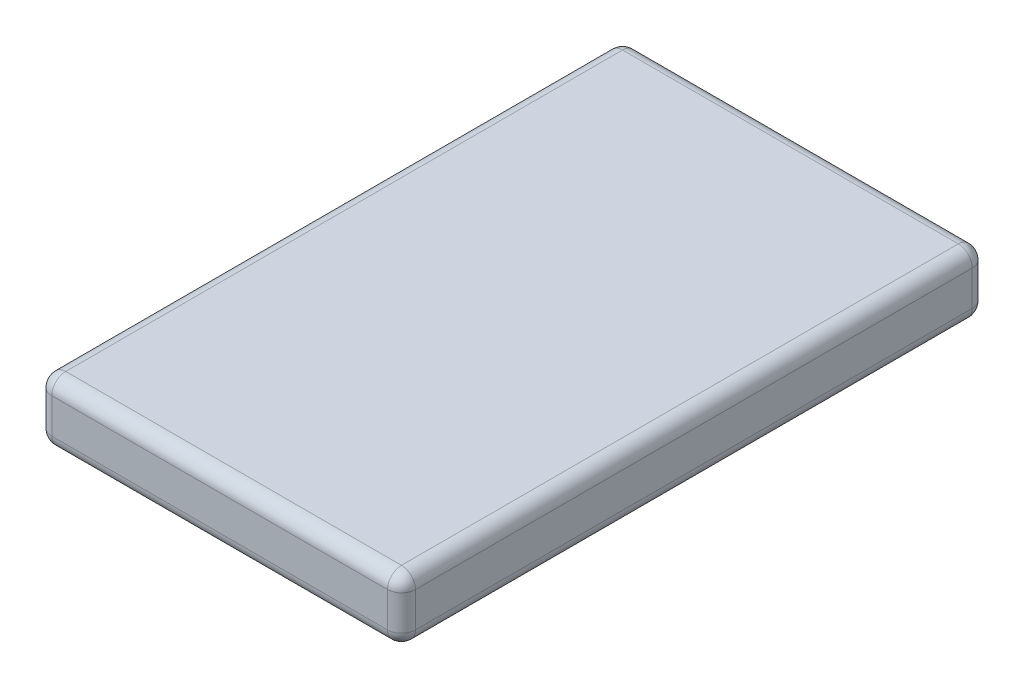
ISO-10303-21;
HEADER;
FILE_DESCRIPTION(('STEP AP214'),'2;1');
FILE_NAME('part.step','',(''),(''),'','','');
FILE_SCHEMA(('AUTOMOTIVE_DESIGN { 1 0 10303 214 1 1 1 1 }'));
ENDSEC;
DATA;
#1=APPLICATION_CONTEXT('core data for automotive mechanical design processes');
#2=APPLICATION_PROTOCOL_DEFINITION('international standard','automotive_design',2000,#1);
#3=PRODUCT_CONTEXT('',#1,'mechanical');
#4=PRODUCT('Part','Part','',(#3));
#5=PRODUCT_RELATED_PRODUCT_CATEGORY('part','',(#4));
#6=PRODUCT_DEFINITION_FORMATION('','',#4);
#7=PRODUCT_DEFINITION_CONTEXT('part definition',#1,'design');
#8=PRODUCT_DEFINITION('design','',#6,#7);
#9=PRODUCT_DEFINITION_SHAPE('','',#8);
#10=(LENGTH_UNIT() NAMED_UNIT(*) SI_UNIT(.MILLI.,.METRE.));
#11=(NAMED_UNIT(*) PLANE_ANGLE_UNIT() SI_UNIT($,.RADIAN.));
#12=(NAMED_UNIT(*) SI_UNIT($,.STERADIAN.) SOLID_ANGLE_UNIT());
#13=UNCERTAINTY_MEASURE_WITH_UNIT(LENGTH_MEASURE(1.E-05),#10,'distance_accuracy_value','');
#14=(GEOMETRIC_REPRESENTATION_CONTEXT(3) GLOBAL_UNCERTAINTY_ASSIGNED_CONTEXT((#13)) GLOBAL_UNIT_ASSIGNED_CONTEXT((#10,
#11,#12)) REPRESENTATION_CONTEXT('',''));
#15=CARTESIAN_POINT('',(0.,0.,0.));
#16=DIRECTION('',(0.,0.,1.));
#17=DIRECTION('',(1.,0.,0.));
#18=AXIS2_PLACEMENT_3D('',#15,#16,#17);
#19=CARTESIAN_POINT('',(16.51,5.715,26.543));
#20=DIRECTION('',(-1.,0.,0.));
#21=DIRECTION('',(0.,0.,1.));
#22=AXIS2_PLACEMENT_3D('',#19,#20,#21);
#23=PLANE('',#22);
#24=DIRECTION('',(0.,-1.,0.));
#25=VECTOR('',#24,1.);
#26=CARTESIAN_POINT('',(16.51,5.715,25.273));
#27=LINE('',#26,#25);
#28=CARTESIAN_POINT('',(16.51,4.445,25.273));
#29=VERTEX_POINT('',#28);
#30=CARTESIAN_POINT('',(16.51,1.27,25.273));
#31=VERTEX_POINT('',#30);
#32=EDGE_CURVE('E175',#29,#31,#27,.T.);
#33=ORIENTED_EDGE('',*,*,#32,.T.);
#34=DIRECTION('',(0.,0.,-1.));
#35=VECTOR('',#34,1.);
#36=CARTESIAN_POINT('',(16.51,1.27,-26.543));
#37=LINE('',#36,#35);
#38=CARTESIAN_POINT('',(16.51,1.27,-25.273));
#39=VERTEX_POINT('',#38);
#40=EDGE_CURVE('E180',#31,#39,#37,.T.);
#41=ORIENTED_EDGE('',*,*,#40,.T.);
#42=DIRECTION('',(0.,-1.,0.));
#43=VECTOR('',#42,1.);
#44=CARTESIAN_POINT('',(16.51,5.715,-25.273));
#45=LINE('',#44,#43);
#46=CARTESIAN_POINT('',(16.51,4.445,-25.273));
#47=VERTEX_POINT('',#46);
#48=EDGE_CURVE('E177',#39,#47,#45,.F.);
#49=ORIENTED_EDGE('',*,*,#48,.T.);
#50=DIRECTION('',(0.,0.,-1.));
#51=VECTOR('',#50,1.);
#52=CARTESIAN_POINT('',(16.51,4.445,26.543));
#53=LINE('',#52,#51);
#54=EDGE_CURVE('E173',#47,#29,#53,.F.);
#55=ORIENTED_EDGE('',*,*,#54,.T.);
#56=EDGE_LOOP('',(#33,#41,#49,#55));
#57=FACE_BOUND('',#56,.T.);
#58=ADVANCED_FACE('F33',(#57),#23,.F.);
#59=CARTESIAN_POINT('',(-16.51,5.715,-26.543));
#60=DIRECTION('',(0.,0.,1.));
#61=DIRECTION('',(1.,0.,0.));
#62=AXIS2_PLACEMENT_3D('',#59,#60,#61);
#63=PLANE('',#62);
#64=DIRECTION('',(0.,-1.,0.));
#65=VECTOR('',#64,1.);
#66=CARTESIAN_POINT('',(15.24,5.715,-26.543));
#67=LINE('',#66,#65);
#68=CARTESIAN_POINT('',(15.24,4.445,-26.543));
#69=VERTEX_POINT('',#68);
#70=CARTESIAN_POINT('',(15.24,1.27,-26.543));
#71=VERTEX_POINT('',#70);
#72=EDGE_CURVE('E166',#69,#71,#67,.T.);
#73=ORIENTED_EDGE('',*,*,#72,.T.);
#74=DIRECTION('',(-1.,0.,0.));
#75=VECTOR('',#74,1.);
#76=CARTESIAN_POINT('',(-16.51,1.27,-26.543));
#77=LINE('',#76,#75);
#78=CARTESIAN_POINT('',(-15.24,1.27,-26.543));
#79=VERTEX_POINT('',#78);
#80=EDGE_CURVE('E171',#71,#79,#77,.T.);
#81=ORIENTED_EDGE('',*,*,#80,.T.);
#82=DIRECTION('',(0.,-1.,0.));
#83=VECTOR('',#82,1.);
#84=CARTESIAN_POINT('',(-15.24,5.715,-26.543));
#85=LINE('',#84,#83);
#86=CARTESIAN_POINT('',(-15.24,4.445,-26.543));
#87=VERTEX_POINT('',#86);
#88=EDGE_CURVE('E168',#79,#87,#85,.F.);
#89=ORIENTED_EDGE('',*,*,#88,.T.);
#90=DIRECTION('',(-1.,0.,0.));
#91=VECTOR('',#90,1.);
#92=CARTESIAN_POINT('',(-16.51,4.445,-26.543));
#93=LINE('',#92,#91);
#94=EDGE_CURVE('E164',#87,#69,#93,.F.);
#95=ORIENTED_EDGE('',*,*,#94,.T.);
#96=EDGE_LOOP('',(#73,#81,#89,#95));
#97=FACE_BOUND('',#96,.T.);
#98=ADVANCED_FACE('F304',(#97),#63,.F.);
#99=CARTESIAN_POINT('',(-16.51,5.715,26.543));
#100=DIRECTION('',(1.,0.,0.));
#101=DIRECTION('',(0.,0.,-1.));
#102=AXIS2_PLACEMENT_3D('',#99,#100,#101);
#103=PLANE('',#102);
#104=DIRECTION('',(0.,-1.,0.));
#105=VECTOR('',#104,1.);
#106=CARTESIAN_POINT('',(-16.51,5.715,-25.273));
#107=LINE('',#106,#105);
#108=CARTESIAN_POINT('',(-16.51,4.445,-25.273));
#109=VERTEX_POINT('',#108);
#110=CARTESIAN_POINT('',(-16.51,1.27,-25.273));
#111=VERTEX_POINT('',#110);
#112=EDGE_CURVE('E132',#109,#111,#107,.T.);
#113=ORIENTED_EDGE('',*,*,#112,.T.);
#114=DIRECTION('',(0.,0.,1.));
#115=VECTOR('',#114,1.);
#116=CARTESIAN_POINT('',(-16.51,1.27,26.543));
#117=LINE('',#116,#115);
#118=CARTESIAN_POINT('',(-16.51,1.27,25.273));
#119=VERTEX_POINT('',#118);
#120=EDGE_CURVE('E128',#111,#119,#117,.T.);
#121=ORIENTED_EDGE('',*,*,#120,.T.);
#122=DIRECTION('',(0.,-1.,0.));
#123=VECTOR('',#122,1.);
#124=CARTESIAN_POINT('',(-16.51,5.715,25.273));
#125=LINE('',#124,#123);
#126=CARTESIAN_POINT('',(-16.51,4.445,25.273));
#127=VERTEX_POINT('',#126);
#128=EDGE_CURVE('E120',#119,#127,#125,.F.);
#129=ORIENTED_EDGE('',*,*,#128,.T.);
#130=DIRECTION('',(0.,0.,1.));
#131=VECTOR('',#130,1.);
#132=CARTESIAN_POINT('',(-16.51,4.445,26.543));
#133=LINE('',#132,#131);
#134=EDGE_CURVE('E125',#127,#109,#133,.F.);
#135=ORIENTED_EDGE('',*,*,#134,.T.);
#136=EDGE_LOOP('',(#113,#121,#129,#135));
#137=FACE_BOUND('',#136,.T.);
#138=ADVANCED_FACE('F123',(#137),#103,.F.);
#139=CARTESIAN_POINT('',(-16.51,5.715,26.543));
#140=DIRECTION('',(0.,0.,-1.));
#141=DIRECTION('',(-1.,0.,0.));
#142=AXIS2_PLACEMENT_3D('',#139,#140,#141);
#143=PLANE('',#142);
#144=DIRECTION('',(0.,-1.,0.));
#145=VECTOR('',#144,1.);
#146=CARTESIAN_POINT('',(-15.24,5.715,26.543));
#147=LINE('',#146,#145);
#148=CARTESIAN_POINT('',(-15.24,4.445,26.543));
#149=VERTEX_POINT('',#148);
#150=CARTESIAN_POINT('',(-15.24,1.27,26.543));
#151=VERTEX_POINT('',#150);
#152=EDGE_CURVE('E140',#149,#151,#147,.T.);
#153=ORIENTED_EDGE('',*,*,#152,.T.);
#154=DIRECTION('',(1.,0.,0.));
#155=VECTOR('',#154,1.);
#156=CARTESIAN_POINT('',(16.51,1.27,26.543));
#157=LINE('',#156,#155);
#158=CARTESIAN_POINT('',(15.24,1.27,26.543));
#159=VERTEX_POINT('',#158);
#160=EDGE_CURVE('E187',#151,#159,#157,.T.);
#161=ORIENTED_EDGE('',*,*,#160,.T.);
#162=DIRECTION('',(0.,-1.,0.));
#163=VECTOR('',#162,1.);
#164=CARTESIAN_POINT('',(15.24,5.715,26.543));
#165=LINE('',#164,#163);
#166=CARTESIAN_POINT('',(15.24,4.445,26.543));
#167=VERTEX_POINT('',#166);
#168=EDGE_CURVE('E184',#159,#167,#165,.F.);
#169=ORIENTED_EDGE('',*,*,#168,.T.);
#170=DIRECTION('',(1.,0.,0.));
#171=VECTOR('',#170,1.);
#172=CARTESIAN_POINT('',(-16.51,4.445,26.543));
#173=LINE('',#172,#171);
#174=EDGE_CURVE('E182',#167,#149,#173,.F.);
#175=ORIENTED_EDGE('',*,*,#174,.T.);
#176=EDGE_LOOP('',(#153,#161,#169,#175));
#177=FACE_BOUND('',#176,.T.);
#178=ADVANCED_FACE('F295',(#177),#143,.F.);
#179=CARTESIAN_POINT('',(16.51,5.715,-26.543));
#180=DIRECTION('',(0.,-1.,0.));
#181=DIRECTION('',(0.,0.,-1.));
#182=AXIS2_PLACEMENT_3D('',#179,#180,#181);
#183=PLANE('',#182);
#184=DIRECTION('',(0.,0.,1.));
#185=VECTOR('',#184,1.);
#186=CARTESIAN_POINT('',(-15.24,5.715,-26.543));
#187=LINE('',#186,#185);
#188=CARTESIAN_POINT('',(-15.24,5.715,-25.273));
#189=VERTEX_POINT('',#188);
#190=CARTESIAN_POINT('',(-15.24,5.715,25.273));
#191=VERTEX_POINT('',#190);
#192=EDGE_CURVE('E42',#189,#191,#187,.T.);
#193=ORIENTED_EDGE('',*,*,#192,.T.);
#194=DIRECTION('',(1.,0.,0.));
#195=VECTOR('',#194,1.);
#196=CARTESIAN_POINT('',(16.51,5.715,25.273));
#197=LINE('',#196,#195);
#198=CARTESIAN_POINT('',(15.24,5.715,25.273));
#199=VERTEX_POINT('',#198);
#200=EDGE_CURVE('E11',#191,#199,#197,.T.);
#201=ORIENTED_EDGE('',*,*,#200,.T.);
#202=DIRECTION('',(0.,0.,-1.));
#203=VECTOR('',#202,1.);
#204=CARTESIAN_POINT('',(15.24,5.715,-26.543));
#205=LINE('',#204,#203);
#206=CARTESIAN_POINT('',(15.24,5.715,-25.273));
#207=VERTEX_POINT('',#206);
#208=EDGE_CURVE('E198',#199,#207,#205,.T.);
#209=ORIENTED_EDGE('',*,*,#208,.T.);
#210=DIRECTION('',(-1.,0.,0.));
#211=VECTOR('',#210,1.);
#212=CARTESIAN_POINT('',(16.51,5.715,-25.273));
#213=LINE('',#212,#211);
#214=EDGE_CURVE('E53',#207,#189,#213,.T.);
#215=ORIENTED_EDGE('',*,*,#214,.T.);
#216=EDGE_LOOP('',(#193,#201,#209,#215));
#217=FACE_BOUND('',#216,.T.);
#218=ADVANCED_FACE('F297',(#217),#183,.F.);
#219=CARTESIAN_POINT('',(16.51,0.,-26.543));
#220=DIRECTION('',(0.,-1.,0.));
#221=DIRECTION('',(0.,0.,-1.));
#222=AXIS2_PLACEMENT_3D('',#219,#220,#221);
#223=PLANE('',#222);
#224=DIRECTION('',(0.,0.,1.));
#225=VECTOR('',#224,1.);
#226=CARTESIAN_POINT('',(-15.24,0.,-26.543));
#227=LINE('',#226,#225);
#228=CARTESIAN_POINT('',(-15.24,0.,25.273));
#229=VERTEX_POINT('',#228);
#230=CARTESIAN_POINT('',(-15.24,0.,-25.273));
#231=VERTEX_POINT('',#230);
#232=EDGE_CURVE('E193',#229,#231,#227,.F.);
#233=ORIENTED_EDGE('',*,*,#232,.T.);
#234=DIRECTION('',(-1.,0.,0.));
#235=VECTOR('',#234,1.);
#236=CARTESIAN_POINT('',(16.51,0.,-25.273));
#237=LINE('',#236,#235);
#238=CARTESIAN_POINT('',(15.24,0.,-25.273));
#239=VERTEX_POINT('',#238);
#240=EDGE_CURVE('E195',#231,#239,#237,.F.);
#241=ORIENTED_EDGE('',*,*,#240,.T.);
#242=DIRECTION('',(0.,0.,-1.));
#243=VECTOR('',#242,1.);
#244=CARTESIAN_POINT('',(15.24,0.,26.543));
#245=LINE('',#244,#243);
#246=CARTESIAN_POINT('',(15.24,0.,25.273));
#247=VERTEX_POINT('',#246);
#248=EDGE_CURVE('E189',#239,#247,#245,.F.);
#249=ORIENTED_EDGE('',*,*,#248,.T.);
#250=DIRECTION('',(1.,0.,0.));
#251=VECTOR('',#250,1.);
#252=CARTESIAN_POINT('',(-16.51,0.,25.273));
#253=LINE('',#252,#251);
#254=EDGE_CURVE('E191',#247,#229,#253,.F.);
#255=ORIENTED_EDGE('',*,*,#254,.T.);
#256=EDGE_LOOP('',(#233,#241,#249,#255));
#257=FACE_BOUND('',#256,.T.);
#258=ADVANCED_FACE('F265',(#257),#223,.T.);
#259=CARTESIAN_POINT('',(15.24,5.715,25.273));
#260=DIRECTION('',(0.,-1.,0.));
#261=DIRECTION('',(0.,0.,-1.));
#262=AXIS2_PLACEMENT_3D('',#259,#260,#261);
#263=CYLINDRICAL_SURFACE('',#262,1.27);
#264=CARTESIAN_POINT('',(15.24,4.445,25.273));
#265=DIRECTION('',(0.,1.,0.));
#266=DIRECTION('',(0.,0.,1.));
#267=AXIS2_PLACEMENT_3D('',#264,#265,#266);
#268=CIRCLE('',#267,1.27);
#269=EDGE_CURVE('E37',#167,#29,#268,.T.);
#270=ORIENTED_EDGE('',*,*,#269,.F.);
#271=ORIENTED_EDGE('',*,*,#168,.F.);
#272=CARTESIAN_POINT('',(15.24,1.27,25.273));
#273=DIRECTION('',(0.,-1.,0.));
#274=DIRECTION('',(0.,0.,-1.));
#275=AXIS2_PLACEMENT_3D('',#272,#273,#274);
#276=CIRCLE('',#275,1.27);
#277=EDGE_CURVE('E160',#31,#159,#276,.T.);
#278=ORIENTED_EDGE('',*,*,#277,.F.);
#279=ORIENTED_EDGE('',*,*,#32,.F.);
#280=EDGE_LOOP('',(#270,#271,#278,#279));
#281=FACE_BOUND('',#280,.T.);
#282=ADVANCED_FACE('F35',(#281),#263,.T.);
#283=CARTESIAN_POINT('',(15.24,4.445,25.273));
#284=DIRECTION('',(0.,0.,1.));
#285=DIRECTION('',(1.,0.,0.));
#286=AXIS2_PLACEMENT_3D('',#283,#284,#285);
#287=SPHERICAL_SURFACE('',#286,1.27);
#288=CARTESIAN_POINT('',(15.24,4.445,25.273));
#289=DIRECTION('',(1.,0.,0.));
#290=DIRECTION('',(0.,0.,-1.));
#291=AXIS2_PLACEMENT_3D('',#288,#289,#290);
#292=CIRCLE('',#291,1.27);
#293=EDGE_CURVE('E243',#167,#199,#292,.F.);
#294=ORIENTED_EDGE('',*,*,#293,.F.);
#295=ORIENTED_EDGE('',*,*,#269,.T.);
#296=CARTESIAN_POINT('',(15.24,4.445,25.273));
#297=DIRECTION('',(0.,0.,1.));
#298=DIRECTION('',(1.,0.,0.));
#299=AXIS2_PLACEMENT_3D('',#296,#297,#298);
#300=CIRCLE('',#299,1.27);
#301=EDGE_CURVE('E246',#199,#29,#300,.F.);
#302=ORIENTED_EDGE('',*,*,#301,.F.);
#303=EDGE_LOOP('',(#294,#295,#302));
#304=FACE_BOUND('',#303,.T.);
#305=ADVANCED_FACE('F290',(#304),#287,.T.);
#306=CARTESIAN_POINT('',(15.24,1.27,25.273));
#307=DIRECTION('',(0.,0.,1.));
#308=DIRECTION('',(1.,0.,0.));
#309=AXIS2_PLACEMENT_3D('',#306,#307,#308);
#310=SPHERICAL_SURFACE('',#309,1.27);
#311=CARTESIAN_POINT('',(15.24,1.27,25.273));
#312=DIRECTION('',(0.,0.,1.));
#313=DIRECTION('',(1.,0.,0.));
#314=AXIS2_PLACEMENT_3D('',#311,#312,#313);
#315=CIRCLE('',#314,1.27);
#316=EDGE_CURVE('E237',#31,#247,#315,.F.);
#317=ORIENTED_EDGE('',*,*,#316,.F.);
#318=ORIENTED_EDGE('',*,*,#277,.T.);
#319=CARTESIAN_POINT('',(15.24,1.27,25.273));
#320=DIRECTION('',(1.,0.,0.));
#321=DIRECTION('',(0.,0.,-1.));
#322=AXIS2_PLACEMENT_3D('',#319,#320,#321);
#323=CIRCLE('',#322,1.27);
#324=EDGE_CURVE('E240',#247,#159,#323,.F.);
#325=ORIENTED_EDGE('',*,*,#324,.F.);
#326=EDGE_LOOP('',(#317,#318,#325));
#327=FACE_BOUND('',#326,.T.);
#328=ADVANCED_FACE('F253',(#327),#310,.T.);
#329=CARTESIAN_POINT('',(15.24,4.445,-26.543));
#330=DIRECTION('',(0.,0.,-1.));
#331=DIRECTION('',(-1.,0.,0.));
#332=AXIS2_PLACEMENT_3D('',#329,#330,#331);
#333=CYLINDRICAL_SURFACE('',#332,1.27);
#334=ORIENTED_EDGE('',*,*,#301,.T.);
#335=ORIENTED_EDGE('',*,*,#54,.F.);
#336=CARTESIAN_POINT('',(15.24,4.445,-25.273));
#337=DIRECTION('',(0.,0.,-1.));
#338=DIRECTION('',(-1.,0.,0.));
#339=AXIS2_PLACEMENT_3D('',#336,#337,#338);
#340=CIRCLE('',#339,1.27);
#341=EDGE_CURVE('E232',#207,#47,#340,.T.);
#342=ORIENTED_EDGE('',*,*,#341,.F.);
#343=ORIENTED_EDGE('',*,*,#208,.F.);
#344=EDGE_LOOP('',(#334,#335,#342,#343));
#345=FACE_BOUND('',#344,.T.);
#346=ADVANCED_FACE('F285',(#345),#333,.T.);
#347=CARTESIAN_POINT('',(16.51,4.445,25.273));
#348=DIRECTION('',(1.,0.,0.));
#349=DIRECTION('',(0.,0.,-1.));
#350=AXIS2_PLACEMENT_3D('',#347,#348,#349);
#351=CYLINDRICAL_SURFACE('',#350,1.27);
#352=ORIENTED_EDGE('',*,*,#293,.T.);
#353=ORIENTED_EDGE('',*,*,#200,.F.);
#354=CARTESIAN_POINT('',(-15.24,4.445,25.273));
#355=DIRECTION('',(-1.,0.,0.));
#356=DIRECTION('',(0.,0.,1.));
#357=AXIS2_PLACEMENT_3D('',#354,#355,#356);
#358=CIRCLE('',#357,1.27);
#359=EDGE_CURVE('E144',#149,#191,#358,.T.);
#360=ORIENTED_EDGE('',*,*,#359,.F.);
#361=ORIENTED_EDGE('',*,*,#174,.F.);
#362=EDGE_LOOP('',(#352,#353,#360,#361));
#363=FACE_BOUND('',#362,.T.);
#364=ADVANCED_FACE('F293',(#363),#351,.T.);
#365=CARTESIAN_POINT('',(-15.24,5.715,25.273));
#366=DIRECTION('',(0.,-1.,0.));
#367=DIRECTION('',(0.,0.,-1.));
#368=AXIS2_PLACEMENT_3D('',#365,#366,#367);
#369=CYLINDRICAL_SURFACE('',#368,1.27);
#370=CARTESIAN_POINT('',(-15.24,1.27,25.273));
#371=DIRECTION('',(0.,-1.,0.));
#372=DIRECTION('',(0.,0.,-1.));
#373=AXIS2_PLACEMENT_3D('',#370,#371,#372);
#374=CIRCLE('',#373,1.27);
#375=EDGE_CURVE('E145',#151,#119,#374,.T.);
#376=ORIENTED_EDGE('',*,*,#375,.F.);
#377=ORIENTED_EDGE('',*,*,#152,.F.);
#378=CARTESIAN_POINT('',(-15.24,4.445,25.273));
#379=DIRECTION('',(0.,1.,0.));
#380=DIRECTION('',(0.,0.,1.));
#381=AXIS2_PLACEMENT_3D('',#378,#379,#380);
#382=CIRCLE('',#381,1.27);
#383=EDGE_CURVE('E136',#127,#149,#382,.T.);
#384=ORIENTED_EDGE('',*,*,#383,.F.);
#385=ORIENTED_EDGE('',*,*,#128,.F.);
#386=EDGE_LOOP('',(#376,#377,#384,#385));
#387=FACE_BOUND('',#386,.T.);
#388=ADVANCED_FACE('F138',(#387),#369,.T.);
#389=CARTESIAN_POINT('',(-16.51,1.27,25.273));
#390=DIRECTION('',(-1.,0.,0.));
#391=DIRECTION('',(0.,0.,1.));
#392=AXIS2_PLACEMENT_3D('',#389,#390,#391);
#393=CYLINDRICAL_SURFACE('',#392,1.27);
#394=ORIENTED_EDGE('',*,*,#324,.T.);
#395=ORIENTED_EDGE('',*,*,#160,.F.);
#396=CARTESIAN_POINT('',(-15.24,1.27,25.273));
#397=DIRECTION('',(-1.,0.,0.));
#398=DIRECTION('',(0.,0.,1.));
#399=AXIS2_PLACEMENT_3D('',#396,#397,#398);
#400=CIRCLE('',#399,1.27);
#401=EDGE_CURVE('E228',#229,#151,#400,.T.);
#402=ORIENTED_EDGE('',*,*,#401,.F.);
#403=ORIENTED_EDGE('',*,*,#254,.F.);
#404=EDGE_LOOP('',(#394,#395,#402,#403));
#405=FACE_BOUND('',#404,.T.);
#406=ADVANCED_FACE('F261',(#405),#393,.T.);
#407=CARTESIAN_POINT('',(15.24,1.27,26.543));
#408=DIRECTION('',(0.,0.,1.));
#409=DIRECTION('',(1.,0.,0.));
#410=AXIS2_PLACEMENT_3D('',#407,#408,#409);
#411=CYLINDRICAL_SURFACE('',#410,1.27);
#412=ORIENTED_EDGE('',*,*,#316,.T.);
#413=ORIENTED_EDGE('',*,*,#248,.F.);
#414=CARTESIAN_POINT('',(15.24,1.27,-25.273));
#415=DIRECTION('',(0.,0.,-1.));
#416=DIRECTION('',(-1.,0.,0.));
#417=AXIS2_PLACEMENT_3D('',#414,#415,#416);
#418=CIRCLE('',#417,1.27);
#419=EDGE_CURVE('E225',#39,#239,#418,.T.);
#420=ORIENTED_EDGE('',*,*,#419,.F.);
#421=ORIENTED_EDGE('',*,*,#40,.F.);
#422=EDGE_LOOP('',(#412,#413,#420,#421));
#423=FACE_BOUND('',#422,.T.);
#424=ADVANCED_FACE('F271',(#423),#411,.T.);
#425=CARTESIAN_POINT('',(15.24,5.715,-25.273));
#426=DIRECTION('',(0.,-1.,0.));
#427=DIRECTION('',(0.,0.,-1.));
#428=AXIS2_PLACEMENT_3D('',#425,#426,#427);
#429=CYLINDRICAL_SURFACE('',#428,1.27);
#430=CARTESIAN_POINT('',(15.24,4.445,-25.273));
#431=DIRECTION('',(0.,1.,0.));
#432=DIRECTION('',(0.,0.,1.));
#433=AXIS2_PLACEMENT_3D('',#430,#431,#432);
#434=CIRCLE('',#433,1.27);
#435=EDGE_CURVE('E234',#47,#69,#434,.T.);
#436=ORIENTED_EDGE('',*,*,#435,.F.);
#437=ORIENTED_EDGE('',*,*,#48,.F.);
#438=CARTESIAN_POINT('',(15.24,1.27,-25.273));
#439=DIRECTION('',(0.,-1.,0.));
#440=DIRECTION('',(0.,0.,-1.));
#441=AXIS2_PLACEMENT_3D('',#438,#439,#440);
#442=CIRCLE('',#441,1.27);
#443=EDGE_CURVE('E222',#71,#39,#442,.T.);
#444=ORIENTED_EDGE('',*,*,#443,.F.);
#445=ORIENTED_EDGE('',*,*,#72,.F.);
#446=EDGE_LOOP('',(#436,#437,#444,#445));
#447=FACE_BOUND('',#446,.T.);
#448=ADVANCED_FACE('F277',(#447),#429,.T.);
#449=CARTESIAN_POINT('',(15.24,4.445,-25.273));
#450=DIRECTION('',(0.,0.,1.));
#451=DIRECTION('',(1.,0.,0.));
#452=AXIS2_PLACEMENT_3D('',#449,#450,#451);
#453=SPHERICAL_SURFACE('',#452,1.27);
#454=ORIENTED_EDGE('',*,*,#341,.T.);
#455=ORIENTED_EDGE('',*,*,#435,.T.);
#456=CARTESIAN_POINT('',(15.24,4.445,-25.273));
#457=DIRECTION('',(1.,0.,0.));
#458=DIRECTION('',(0.,0.,-1.));
#459=AXIS2_PLACEMENT_3D('',#456,#457,#458);
#460=CIRCLE('',#459,1.27);
#461=EDGE_CURVE('E151',#207,#69,#460,.F.);
#462=ORIENTED_EDGE('',*,*,#461,.F.);
#463=EDGE_LOOP('',(#454,#455,#462));
#464=FACE_BOUND('',#463,.T.);
#465=ADVANCED_FACE('F351',(#464),#453,.T.);
#466=CARTESIAN_POINT('',(-15.24,4.445,25.273));
#467=DIRECTION('',(0.,0.,1.));
#468=DIRECTION('',(1.,0.,0.));
#469=AXIS2_PLACEMENT_3D('',#466,#467,#468);
#470=SPHERICAL_SURFACE('',#469,1.27);
#471=ORIENTED_EDGE('',*,*,#383,.T.);
#472=ORIENTED_EDGE('',*,*,#359,.T.);
#473=CARTESIAN_POINT('',(-15.24,4.445,25.273));
#474=DIRECTION('',(0.,0.,1.));
#475=DIRECTION('',(1.,0.,0.));
#476=AXIS2_PLACEMENT_3D('',#473,#474,#475);
#477=CIRCLE('',#476,1.27);
#478=EDGE_CURVE('E148',#127,#191,#477,.F.);
#479=ORIENTED_EDGE('',*,*,#478,.F.);
#480=EDGE_LOOP('',(#471,#472,#479));
#481=FACE_BOUND('',#480,.T.);
#482=ADVANCED_FACE('F149',(#481),#470,.T.);
#483=CARTESIAN_POINT('',(-15.24,1.27,25.273));
#484=DIRECTION('',(0.,0.,1.));
#485=DIRECTION('',(1.,0.,0.));
#486=AXIS2_PLACEMENT_3D('',#483,#484,#485);
#487=SPHERICAL_SURFACE('',#486,1.27);
#488=ORIENTED_EDGE('',*,*,#401,.T.);
#489=ORIENTED_EDGE('',*,*,#375,.T.);
#490=CARTESIAN_POINT('',(-15.24,1.27,25.273));
#491=DIRECTION('',(0.,0.,1.));
#492=DIRECTION('',(1.,0.,0.));
#493=AXIS2_PLACEMENT_3D('',#490,#491,#492);
#494=CIRCLE('',#493,1.27);
#495=EDGE_CURVE('E152',#229,#119,#494,.F.);
#496=ORIENTED_EDGE('',*,*,#495,.F.);
#497=EDGE_LOOP('',(#488,#489,#496));
#498=FACE_BOUND('',#497,.T.);
#499=ADVANCED_FACE('F344',(#498),#487,.T.);
#500=CARTESIAN_POINT('',(15.24,1.27,-25.273));
#501=DIRECTION('',(0.,0.,1.));
#502=DIRECTION('',(1.,0.,0.));
#503=AXIS2_PLACEMENT_3D('',#500,#501,#502);
#504=SPHERICAL_SURFACE('',#503,1.27);
#505=ORIENTED_EDGE('',*,*,#443,.T.);
#506=ORIENTED_EDGE('',*,*,#419,.T.);
#507=CARTESIAN_POINT('',(15.24,1.27,-25.273));
#508=DIRECTION('',(1.,0.,0.));
#509=DIRECTION('',(0.,0.,-1.));
#510=AXIS2_PLACEMENT_3D('',#507,#508,#509);
#511=CIRCLE('',#510,1.27);
#512=EDGE_CURVE('E216',#71,#239,#511,.F.);
#513=ORIENTED_EDGE('',*,*,#512,.F.);
#514=EDGE_LOOP('',(#505,#506,#513));
#515=FACE_BOUND('',#514,.T.);
#516=ADVANCED_FACE('F340',(#515),#504,.T.);
#517=CARTESIAN_POINT('',(16.51,4.445,-25.273));
#518=DIRECTION('',(-1.,0.,0.));
#519=DIRECTION('',(0.,0.,1.));
#520=AXIS2_PLACEMENT_3D('',#517,#518,#519);
#521=CYLINDRICAL_SURFACE('',#520,1.27);
#522=ORIENTED_EDGE('',*,*,#461,.T.);
#523=ORIENTED_EDGE('',*,*,#94,.F.);
#524=CARTESIAN_POINT('',(-15.24,4.445,-25.273));
#525=DIRECTION('',(-1.,0.,0.));
#526=DIRECTION('',(0.,0.,1.));
#527=AXIS2_PLACEMENT_3D('',#524,#525,#526);
#528=CIRCLE('',#527,1.27);
#529=EDGE_CURVE('E213',#189,#87,#528,.T.);
#530=ORIENTED_EDGE('',*,*,#529,.F.);
#531=ORIENTED_EDGE('',*,*,#214,.F.);
#532=EDGE_LOOP('',(#522,#523,#530,#531));
#533=FACE_BOUND('',#532,.T.);
#534=ADVANCED_FACE('F337',(#533),#521,.T.);
#535=CARTESIAN_POINT('',(-15.24,4.445,-26.543));
#536=DIRECTION('',(0.,0.,1.));
#537=DIRECTION('',(1.,0.,0.));
#538=AXIS2_PLACEMENT_3D('',#535,#536,#537);
#539=CYLINDRICAL_SURFACE('',#538,1.27);
#540=ORIENTED_EDGE('',*,*,#478,.T.);
#541=ORIENTED_EDGE('',*,*,#192,.F.);
#542=CARTESIAN_POINT('',(-15.24,4.445,-25.273));
#543=DIRECTION('',(0.,0.,-1.));
#544=DIRECTION('',(-1.,0.,0.));
#545=AXIS2_PLACEMENT_3D('',#542,#543,#544);
#546=CIRCLE('',#545,1.27);
#547=EDGE_CURVE('E156',#109,#189,#546,.T.);
#548=ORIENTED_EDGE('',*,*,#547,.F.);
#549=ORIENTED_EDGE('',*,*,#134,.F.);
#550=EDGE_LOOP('',(#540,#541,#548,#549));
#551=FACE_BOUND('',#550,.T.);
#552=ADVANCED_FACE('F154',(#551),#539,.T.);
#553=CARTESIAN_POINT('',(-15.24,1.27,26.543));
#554=DIRECTION('',(0.,0.,-1.));
#555=DIRECTION('',(-1.,0.,0.));
#556=AXIS2_PLACEMENT_3D('',#553,#554,#555);
#557=CYLINDRICAL_SURFACE('',#556,1.27);
#558=ORIENTED_EDGE('',*,*,#495,.T.);
#559=ORIENTED_EDGE('',*,*,#120,.F.);
#560=CARTESIAN_POINT('',(-15.24,1.27,-25.273));
#561=DIRECTION('',(0.,0.,-1.));
#562=DIRECTION('',(-1.,0.,0.));
#563=AXIS2_PLACEMENT_3D('',#560,#561,#562);
#564=CIRCLE('',#563,1.27);
#565=EDGE_CURVE('E209',#231,#111,#564,.T.);
#566=ORIENTED_EDGE('',*,*,#565,.F.);
#567=ORIENTED_EDGE('',*,*,#232,.F.);
#568=EDGE_LOOP('',(#558,#559,#566,#567));
#569=FACE_BOUND('',#568,.T.);
#570=ADVANCED_FACE('F330',(#569),#557,.T.);
#571=CARTESIAN_POINT('',(-16.51,1.27,-25.273));
#572=DIRECTION('',(1.,0.,0.));
#573=DIRECTION('',(0.,0.,-1.));
#574=AXIS2_PLACEMENT_3D('',#571,#572,#573);
#575=CYLINDRICAL_SURFACE('',#574,1.27);
#576=ORIENTED_EDGE('',*,*,#512,.T.);
#577=ORIENTED_EDGE('',*,*,#240,.F.);
#578=CARTESIAN_POINT('',(-15.24,1.27,-25.273));
#579=DIRECTION('',(-1.,0.,0.));
#580=DIRECTION('',(0.,0.,1.));
#581=AXIS2_PLACEMENT_3D('',#578,#579,#580);
#582=CIRCLE('',#581,1.27);
#583=EDGE_CURVE('E206',#79,#231,#582,.T.);
#584=ORIENTED_EDGE('',*,*,#583,.F.);
#585=ORIENTED_EDGE('',*,*,#80,.F.);
#586=EDGE_LOOP('',(#576,#577,#584,#585));
#587=FACE_BOUND('',#586,.T.);
#588=ADVANCED_FACE('F326',(#587),#575,.T.);
#589=CARTESIAN_POINT('',(-15.24,4.445,-25.273));
#590=DIRECTION('',(0.,0.,1.));
#591=DIRECTION('',(1.,0.,0.));
#592=AXIS2_PLACEMENT_3D('',#589,#590,#591);
#593=SPHERICAL_SURFACE('',#592,1.27);
#594=ORIENTED_EDGE('',*,*,#547,.T.);
#595=ORIENTED_EDGE('',*,*,#529,.T.);
#596=CARTESIAN_POINT('',(-15.24,4.445,-25.273));
#597=DIRECTION('',(0.,1.,0.));
#598=DIRECTION('',(0.,0.,1.));
#599=AXIS2_PLACEMENT_3D('',#596,#597,#598);
#600=CIRCLE('',#599,1.27);
#601=EDGE_CURVE('E204',#109,#87,#600,.F.);
#602=ORIENTED_EDGE('',*,*,#601,.F.);
#603=EDGE_LOOP('',(#594,#595,#602));
#604=FACE_BOUND('',#603,.T.);
#605=ADVANCED_FACE('F322',(#604),#593,.T.);
#606=CARTESIAN_POINT('',(-15.24,1.27,-25.273));
#607=DIRECTION('',(0.,0.,1.));
#608=DIRECTION('',(1.,0.,0.));
#609=AXIS2_PLACEMENT_3D('',#606,#607,#608);
#610=SPHERICAL_SURFACE('',#609,1.27);
#611=ORIENTED_EDGE('',*,*,#583,.T.);
#612=ORIENTED_EDGE('',*,*,#565,.T.);
#613=CARTESIAN_POINT('',(-15.24,1.27,-25.273));
#614=DIRECTION('',(0.,-1.,0.));
#615=DIRECTION('',(0.,0.,-1.));
#616=AXIS2_PLACEMENT_3D('',#613,#614,#615);
#617=CIRCLE('',#616,1.27);
#618=EDGE_CURVE('E202',#79,#111,#617,.F.);
#619=ORIENTED_EDGE('',*,*,#618,.F.);
#620=EDGE_LOOP('',(#611,#612,#619));
#621=FACE_BOUND('',#620,.T.);
#622=ADVANCED_FACE('F318',(#621),#610,.T.);
#623=CARTESIAN_POINT('',(-15.24,5.715,-25.273));
#624=DIRECTION('',(0.,-1.,0.));
#625=DIRECTION('',(0.,0.,-1.));
#626=AXIS2_PLACEMENT_3D('',#623,#624,#625);
#627=CYLINDRICAL_SURFACE('',#626,1.27);
#628=ORIENTED_EDGE('',*,*,#601,.T.);
#629=ORIENTED_EDGE('',*,*,#88,.F.);
#630=ORIENTED_EDGE('',*,*,#618,.T.);
#631=ORIENTED_EDGE('',*,*,#112,.F.);
#632=EDGE_LOOP('',(#628,#629,#630,#631));
#633=FACE_BOUND('',#632,.T.);
#634=ADVANCED_FACE('F315',(#633),#627,.T.);
#635=CLOSED_SHELL('',(#58,#98,#138,#178,#218,#258,#282,#305,#328,#346,#364,#388,#406,#424,#448,
#465,#482,#499,#516,#534,#552,#570,#588,#605,#622,#634));
#636=MANIFOLD_SOLID_BREP('B2',#635);
#637=ADVANCED_BREP_SHAPE_REPRESENTATION('',(#18,#636),#14);
#638=SHAPE_DEFINITION_REPRESENTATION(#9,#637);
ENDSEC;
END-ISO-10303-21;
